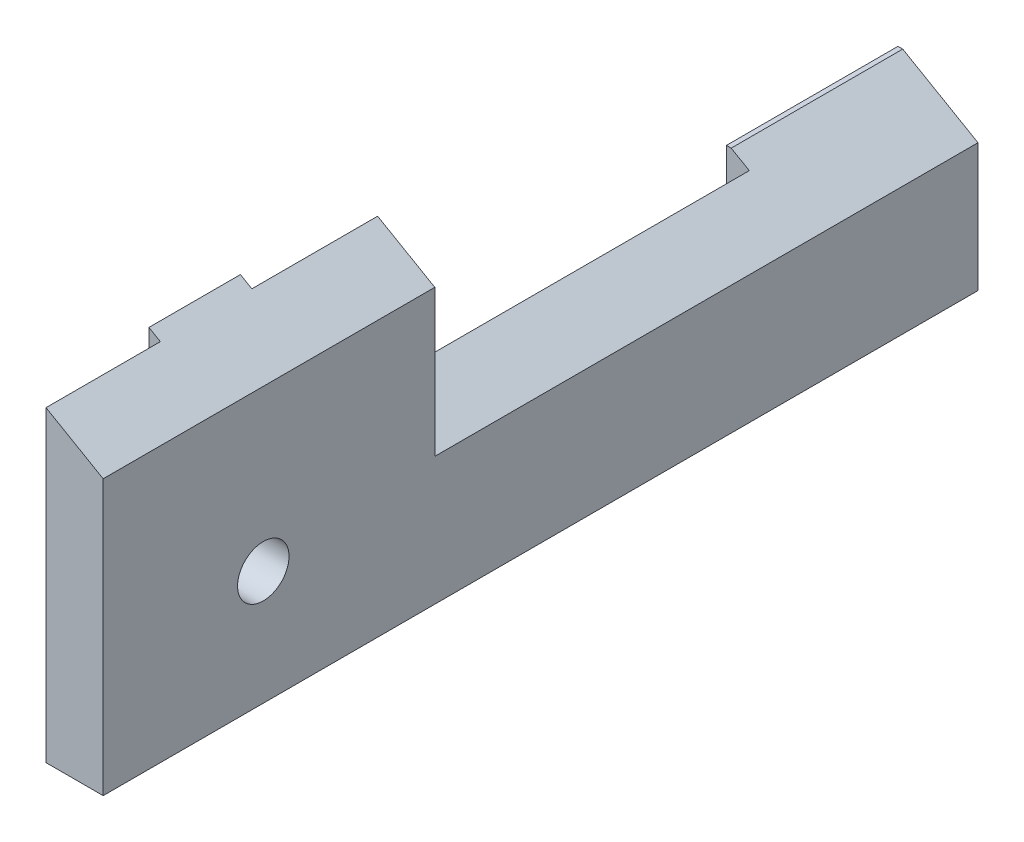
ISO-10303-21;
HEADER;
FILE_DESCRIPTION(('STEP AP214'),'2;1');
FILE_NAME('part.step','',(''),(''),'','','');
FILE_SCHEMA(('AUTOMOTIVE_DESIGN { 1 0 10303 214 1 1 1 1 }'));
ENDSEC;
DATA;
#1=APPLICATION_CONTEXT('core data for automotive mechanical design processes');
#2=APPLICATION_PROTOCOL_DEFINITION('international standard','automotive_design',2000,#1);
#3=PRODUCT_CONTEXT('',#1,'mechanical');
#4=PRODUCT('Part','Part','',(#3));
#5=PRODUCT_RELATED_PRODUCT_CATEGORY('part','',(#4));
#6=PRODUCT_DEFINITION_FORMATION('','',#4);
#7=PRODUCT_DEFINITION_CONTEXT('part definition',#1,'design');
#8=PRODUCT_DEFINITION('design','',#6,#7);
#9=PRODUCT_DEFINITION_SHAPE('','',#8);
#10=(LENGTH_UNIT() NAMED_UNIT(*) SI_UNIT(.MILLI.,.METRE.));
#11=(NAMED_UNIT(*) PLANE_ANGLE_UNIT() SI_UNIT($,.RADIAN.));
#12=(NAMED_UNIT(*) SI_UNIT($,.STERADIAN.) SOLID_ANGLE_UNIT());
#13=UNCERTAINTY_MEASURE_WITH_UNIT(LENGTH_MEASURE(1.E-05),#10,'distance_accuracy_value','');
#14=(GEOMETRIC_REPRESENTATION_CONTEXT(3) GLOBAL_UNCERTAINTY_ASSIGNED_CONTEXT((#13)) GLOBAL_UNIT_ASSIGNED_CONTEXT((#10,
#11,#12)) REPRESENTATION_CONTEXT('',''));
#15=CARTESIAN_POINT('',(0.,0.,0.));
#16=DIRECTION('',(0.,0.,1.));
#17=DIRECTION('',(1.,0.,0.));
#18=AXIS2_PLACEMENT_3D('',#15,#16,#17);
#19=CARTESIAN_POINT('',(0.,14.,-38.25));
#20=DIRECTION('',(-1.,0.,0.));
#21=DIRECTION('',(0.,0.,1.));
#22=AXIS2_PLACEMENT_3D('',#19,#20,#21);
#23=PLANE('',#22);
#24=CARTESIAN_POINT('',(0.,-4.,24.25));
#25=DIRECTION('',(1.,0.,0.));
#26=DIRECTION('',(0.,0.,-1.));
#27=AXIS2_PLACEMENT_3D('',#24,#25,#26);
#28=CIRCLE('',#27,2.25);
#29=CARTESIAN_POINT('',(0.,-4.,22.));
#30=VERTEX_POINT('',#29);
#31=EDGE_CURVE('E164',#30,#30,#28,.T.);
#32=ORIENTED_EDGE('',*,*,#31,.F.);
#33=EDGE_LOOP('',(#32));
#34=FACE_BOUND('',#33,.T.);
#35=DIRECTION('',(0.,-1.,0.));
#36=VECTOR('',#35,1.);
#37=CARTESIAN_POINT('',(0.,14.,-38.25));
#38=LINE('',#37,#36);
#39=CARTESIAN_POINT('',(0.,-2.80000000000005,-38.25));
#40=VERTEX_POINT('',#39);
#41=CARTESIAN_POINT('',(0.,-14.,-38.25));
#42=VERTEX_POINT('',#41);
#43=EDGE_CURVE('E152',#40,#42,#38,.T.);
#44=ORIENTED_EDGE('',*,*,#43,.F.);
#45=DIRECTION('',(0.,0.,1.));
#46=VECTOR('',#45,1.);
#47=CARTESIAN_POINT('',(0.,-2.80000000000005,-38.25));
#48=LINE('',#47,#46);
#49=CARTESIAN_POINT('',(0.,-2.80000000000005,9.24999999999999));
#50=VERTEX_POINT('',#49);
#51=EDGE_CURVE('E184',#40,#50,#48,.T.);
#52=ORIENTED_EDGE('',*,*,#51,.T.);
#53=DIRECTION('',(0.,-1.,0.));
#54=VECTOR('',#53,1.);
#55=CARTESIAN_POINT('',(0.,14.,9.24999999999999));
#56=LINE('',#55,#54);
#57=CARTESIAN_POINT('',(0.,9.99999999999995,9.24999999999999));
#58=VERTEX_POINT('',#57);
#59=EDGE_CURVE('E146',#58,#50,#56,.T.);
#60=ORIENTED_EDGE('',*,*,#59,.F.);
#61=DIRECTION('',(0.,0.,1.));
#62=VECTOR('',#61,1.);
#63=CARTESIAN_POINT('',(0.,9.99999999999995,-38.25));
#64=LINE('',#63,#62);
#65=CARTESIAN_POINT('',(0.,9.99999999999995,38.25));
#66=VERTEX_POINT('',#65);
#67=EDGE_CURVE('E172',#58,#66,#64,.T.);
#68=ORIENTED_EDGE('',*,*,#67,.T.);
#69=DIRECTION('',(0.,-1.,0.));
#70=VECTOR('',#69,1.);
#71=CARTESIAN_POINT('',(0.,14.,38.25));
#72=LINE('',#71,#70);
#73=CARTESIAN_POINT('',(0.,-14.,38.25));
#74=VERTEX_POINT('',#73);
#75=EDGE_CURVE('E202',#66,#74,#72,.T.);
#76=ORIENTED_EDGE('',*,*,#75,.T.);
#77=DIRECTION('',(0.,0.,-1.));
#78=VECTOR('',#77,1.);
#79=CARTESIAN_POINT('',(0.,-14.,-38.25));
#80=LINE('',#79,#78);
#81=EDGE_CURVE('E163',#74,#42,#80,.T.);
#82=ORIENTED_EDGE('',*,*,#81,.T.);
#83=EDGE_LOOP('',(#44,#52,#60,#68,#76,#82));
#84=FACE_BOUND('',#83,.T.);
#85=ADVANCED_FACE('F35',(#34,#84),#23,.F.);
#86=CARTESIAN_POINT('',(0.,14.,-38.25));
#87=DIRECTION('',(0.,0.,1.));
#88=DIRECTION('',(1.,0.,0.));
#89=AXIS2_PLACEMENT_3D('',#86,#87,#88);
#90=PLANE('',#89);
#91=DIRECTION('',(1.,0.,0.));
#92=VECTOR('',#91,1.);
#93=CARTESIAN_POINT('',(-7.00000000000008,0.999999999999999,-38.25));
#94=LINE('',#93,#92);
#95=CARTESIAN_POINT('',(-7.00000000000008,0.999999999999999,-38.25));
#96=VERTEX_POINT('',#95);
#97=CARTESIAN_POINT('',(-6.58179306876187,0.999999999999999,-38.25));
#98=VERTEX_POINT('',#97);
#99=EDGE_CURVE('E129',#96,#98,#94,.T.);
#100=ORIENTED_EDGE('',*,*,#99,.T.);
#101=DIRECTION('',(-0.866025403784441,0.499999999999997,0.));
#102=VECTOR('',#101,1.);
#103=CARTESIAN_POINT('',(-6.58179306876187,0.999999999999999,-38.25));
#104=LINE('',#103,#102);
#105=EDGE_CURVE('E182',#98,#40,#104,.F.);
#106=ORIENTED_EDGE('',*,*,#105,.T.);
#107=ORIENTED_EDGE('',*,*,#43,.T.);
#108=DIRECTION('',(-1.,0.,0.));
#109=VECTOR('',#108,1.);
#110=CARTESIAN_POINT('',(0.,-14.,-38.25));
#111=LINE('',#110,#109);
#112=CARTESIAN_POINT('',(-7.00000000000008,-14.,-38.25));
#113=VERTEX_POINT('',#112);
#114=EDGE_CURVE('E150',#42,#113,#111,.T.);
#115=ORIENTED_EDGE('',*,*,#114,.T.);
#116=DIRECTION('',(0.,-1.,0.));
#117=VECTOR('',#116,1.);
#118=CARTESIAN_POINT('',(-7.00000000000008,14.,-38.25));
#119=LINE('',#118,#117);
#120=EDGE_CURVE('E143',#96,#113,#119,.T.);
#121=ORIENTED_EDGE('',*,*,#120,.F.);
#122=EDGE_LOOP('',(#100,#106,#107,#115,#121));
#123=FACE_BOUND('',#122,.T.);
#124=ADVANCED_FACE('F148',(#123),#90,.F.);
#125=CARTESIAN_POINT('',(-7.00000000000008,14.,-38.25));
#126=DIRECTION('',(1.,0.,0.));
#127=DIRECTION('',(0.,0.,-1.));
#128=AXIS2_PLACEMENT_3D('',#125,#126,#127);
#129=PLANE('',#128);
#130=DIRECTION('',(0.,-1.,0.));
#131=VECTOR('',#130,1.);
#132=CARTESIAN_POINT('',(-7.00000000000008,14.,-23.25));
#133=LINE('',#132,#131);
#134=CARTESIAN_POINT('',(-7.00000000000008,0.999999999999999,-23.25));
#135=VERTEX_POINT('',#134);
#136=CARTESIAN_POINT('',(-7.00000000000008,-14.,-23.25));
#137=VERTEX_POINT('',#136);
#138=EDGE_CURVE('E145',#135,#137,#133,.T.);
#139=ORIENTED_EDGE('',*,*,#138,.F.);
#140=DIRECTION('',(0.,0.,-1.));
#141=VECTOR('',#140,1.);
#142=CARTESIAN_POINT('',(-7.00000000000008,0.999999999999999,9.24999999999999));
#143=LINE('',#142,#141);
#144=EDGE_CURVE('E133',#135,#96,#143,.T.);
#145=ORIENTED_EDGE('',*,*,#144,.T.);
#146=ORIENTED_EDGE('',*,*,#120,.T.);
#147=DIRECTION('',(0.,0.,1.));
#148=VECTOR('',#147,1.);
#149=CARTESIAN_POINT('',(-7.00000000000008,-14.,-38.25));
#150=LINE('',#149,#148);
#151=EDGE_CURVE('E207',#113,#137,#150,.T.);
#152=ORIENTED_EDGE('',*,*,#151,.T.);
#153=EDGE_LOOP('',(#139,#145,#146,#152));
#154=FACE_BOUND('',#153,.T.);
#155=ADVANCED_FACE('F141',(#154),#129,.F.);
#156=CARTESIAN_POINT('',(-7.00000000000008,14.,-23.25));
#157=DIRECTION('',(0.,0.,-1.));
#158=DIRECTION('',(-1.,0.,0.));
#159=AXIS2_PLACEMENT_3D('',#156,#157,#158);
#160=PLANE('',#159);
#161=DIRECTION('',(0.,-1.,0.));
#162=VECTOR('',#161,1.);
#163=CARTESIAN_POINT('',(-5.00000000000013,14.,-23.25));
#164=LINE('',#163,#162);
#165=CARTESIAN_POINT('',(-5.00000000000013,0.0867513459481324,-23.25));
#166=VERTEX_POINT('',#165);
#167=CARTESIAN_POINT('',(-5.00000000000013,-14.,-23.25));
#168=VERTEX_POINT('',#167);
#169=EDGE_CURVE('E156',#166,#168,#164,.T.);
#170=ORIENTED_EDGE('',*,*,#169,.F.);
#171=DIRECTION('',(0.866025403784441,-0.499999999999996,0.));
#172=VECTOR('',#171,1.);
#173=CARTESIAN_POINT('',(-6.58179306876183,0.999999999999975,-23.25));
#174=LINE('',#173,#172);
#175=CARTESIAN_POINT('',(-6.58179306876187,0.999999999999999,-23.25));
#176=VERTEX_POINT('',#175);
#177=EDGE_CURVE('E43',#166,#176,#174,.F.);
#178=ORIENTED_EDGE('',*,*,#177,.T.);
#179=DIRECTION('',(-1.,0.,0.));
#180=VECTOR('',#179,1.);
#181=CARTESIAN_POINT('',(-7.00000000000008,0.999999999999999,-23.25));
#182=LINE('',#181,#180);
#183=EDGE_CURVE('E190',#176,#135,#182,.T.);
#184=ORIENTED_EDGE('',*,*,#183,.T.);
#185=ORIENTED_EDGE('',*,*,#138,.T.);
#186=DIRECTION('',(1.,0.,0.));
#187=VECTOR('',#186,1.);
#188=CARTESIAN_POINT('',(-7.00000000000008,-14.,-23.25));
#189=LINE('',#188,#187);
#190=EDGE_CURVE('E212',#137,#168,#189,.T.);
#191=ORIENTED_EDGE('',*,*,#190,.T.);
#192=EDGE_LOOP('',(#170,#178,#184,#185,#191));
#193=FACE_BOUND('',#192,.T.);
#194=ADVANCED_FACE('F189',(#193),#160,.F.);
#195=CARTESIAN_POINT('',(-5.00000000000013,14.,20.25));
#196=DIRECTION('',(1.,0.,0.));
#197=DIRECTION('',(0.,0.,-1.));
#198=AXIS2_PLACEMENT_3D('',#195,#196,#197);
#199=PLANE('',#198);
#200=DIRECTION('',(0.,-1.,0.));
#201=VECTOR('',#200,1.);
#202=CARTESIAN_POINT('',(-5.00000000000013,14.,9.24999999999999));
#203=LINE('',#202,#201);
#204=CARTESIAN_POINT('',(-5.00000000000013,12.8867513459481,9.24999999999999));
#205=VERTEX_POINT('',#204);
#206=CARTESIAN_POINT('',(-5.00000000000013,0.086751345948132,9.24999999999999));
#207=VERTEX_POINT('',#206);
#208=EDGE_CURVE('E50',#205,#207,#203,.T.);
#209=ORIENTED_EDGE('',*,*,#208,.T.);
#210=DIRECTION('',(0.,0.,1.));
#211=VECTOR('',#210,1.);
#212=CARTESIAN_POINT('',(-5.00000000000013,0.0867513459481321,9.24999999999999));
#213=LINE('',#212,#211);
#214=EDGE_CURVE('E54',#207,#166,#213,.F.);
#215=ORIENTED_EDGE('',*,*,#214,.T.);
#216=ORIENTED_EDGE('',*,*,#169,.T.);
#217=DIRECTION('',(0.,0.,1.));
#218=VECTOR('',#217,1.);
#219=CARTESIAN_POINT('',(-5.00000000000013,-14.,20.25));
#220=LINE('',#219,#218);
#221=CARTESIAN_POINT('',(-5.00000000000013,-14.,20.25));
#222=VERTEX_POINT('',#221);
#223=EDGE_CURVE('E214',#168,#222,#220,.T.);
#224=ORIENTED_EDGE('',*,*,#223,.T.);
#225=DIRECTION('',(0.,-1.,0.));
#226=VECTOR('',#225,1.);
#227=CARTESIAN_POINT('',(-5.00000000000013,14.,20.25));
#228=LINE('',#227,#226);
#229=CARTESIAN_POINT('',(-5.00000000000013,12.8867513459481,20.25));
#230=VERTEX_POINT('',#229);
#231=EDGE_CURVE('E240',#230,#222,#228,.T.);
#232=ORIENTED_EDGE('',*,*,#231,.F.);
#233=DIRECTION('',(0.,0.,1.));
#234=VECTOR('',#233,1.);
#235=CARTESIAN_POINT('',(-5.00000000000013,12.8867513459481,0.));
#236=LINE('',#235,#234);
#237=EDGE_CURVE('E168',#230,#205,#236,.F.);
#238=ORIENTED_EDGE('',*,*,#237,.T.);
#239=EDGE_LOOP('',(#209,#215,#216,#224,#232,#238));
#240=FACE_BOUND('',#239,.T.);
#241=ADVANCED_FACE('F241',(#240),#199,.F.);
#242=CARTESIAN_POINT('',(-5.00000000000013,14.,20.25));
#243=DIRECTION('',(0.,0.,1.));
#244=DIRECTION('',(1.,0.,0.));
#245=AXIS2_PLACEMENT_3D('',#242,#243,#244);
#246=PLANE('',#245);
#247=DIRECTION('',(0.,-1.,0.));
#248=VECTOR('',#247,1.);
#249=CARTESIAN_POINT('',(-6.00000000000013,14.,20.25));
#250=LINE('',#249,#248);
#251=CARTESIAN_POINT('',(-6.00000000000013,13.4641016151377,20.25));
#252=VERTEX_POINT('',#251);
#253=CARTESIAN_POINT('',(-6.00000000000013,-14.,20.25));
#254=VERTEX_POINT('',#253);
#255=EDGE_CURVE('E238',#252,#254,#250,.T.);
#256=ORIENTED_EDGE('',*,*,#255,.F.);
#257=DIRECTION('',(-0.866025403784441,0.499999999999997,0.));
#258=VECTOR('',#257,1.);
#259=CARTESIAN_POINT('',(-6.92820323027571,14.,20.25));
#260=LINE('',#259,#258);
#261=EDGE_CURVE('E166',#252,#230,#260,.F.);
#262=ORIENTED_EDGE('',*,*,#261,.T.);
#263=ORIENTED_EDGE('',*,*,#231,.T.);
#264=DIRECTION('',(-1.,0.,0.));
#265=VECTOR('',#264,1.);
#266=CARTESIAN_POINT('',(-5.00000000000013,-14.,20.25));
#267=LINE('',#266,#265);
#268=EDGE_CURVE('E217',#222,#254,#267,.T.);
#269=ORIENTED_EDGE('',*,*,#268,.T.);
#270=EDGE_LOOP('',(#256,#262,#263,#269));
#271=FACE_BOUND('',#270,.T.);
#272=ADVANCED_FACE('F251',(#271),#246,.F.);
#273=CARTESIAN_POINT('',(-6.00000000000013,14.,20.25));
#274=DIRECTION('',(1.,0.,0.));
#275=DIRECTION('',(0.,0.,-1.));
#276=AXIS2_PLACEMENT_3D('',#273,#274,#275);
#277=PLANE('',#276);
#278=CARTESIAN_POINT('',(-6.00000000000012,-4.,24.25));
#279=DIRECTION('',(1.,0.,0.));
#280=DIRECTION('',(0.,0.,-1.));
#281=AXIS2_PLACEMENT_3D('',#278,#279,#280);
#282=CIRCLE('',#281,2.25);
#283=CARTESIAN_POINT('',(-6.00000000000012,-4.,22.));
#284=VERTEX_POINT('',#283);
#285=EDGE_CURVE('E160',#284,#284,#282,.T.);
#286=ORIENTED_EDGE('',*,*,#285,.T.);
#287=EDGE_LOOP('',(#286));
#288=FACE_BOUND('',#287,.T.);
#289=DIRECTION('',(0.,-1.,0.));
#290=VECTOR('',#289,1.);
#291=CARTESIAN_POINT('',(-6.00000000000012,14.,28.25));
#292=LINE('',#291,#290);
#293=CARTESIAN_POINT('',(-6.00000000000012,13.4641016151377,28.25));
#294=VERTEX_POINT('',#293);
#295=CARTESIAN_POINT('',(-6.00000000000012,-14.,28.25));
#296=VERTEX_POINT('',#295);
#297=EDGE_CURVE('E236',#294,#296,#292,.T.);
#298=ORIENTED_EDGE('',*,*,#297,.F.);
#299=DIRECTION('',(0.,0.,1.));
#300=VECTOR('',#299,1.);
#301=CARTESIAN_POINT('',(-6.00000000000013,13.4641016151378,0.));
#302=LINE('',#301,#300);
#303=EDGE_CURVE('E154',#294,#252,#302,.F.);
#304=ORIENTED_EDGE('',*,*,#303,.T.);
#305=ORIENTED_EDGE('',*,*,#255,.T.);
#306=DIRECTION('',(0.,0.,1.));
#307=VECTOR('',#306,1.);
#308=CARTESIAN_POINT('',(-6.00000000000013,-14.,20.25));
#309=LINE('',#308,#307);
#310=EDGE_CURVE('E220',#254,#296,#309,.T.);
#311=ORIENTED_EDGE('',*,*,#310,.T.);
#312=EDGE_LOOP('',(#298,#304,#305,#311));
#313=FACE_BOUND('',#312,.T.);
#314=ADVANCED_FACE('F276',(#288,#313),#277,.F.);
#315=CARTESIAN_POINT('',(-5.00000000000013,14.,28.25));
#316=DIRECTION('',(0.,0.,-1.));
#317=DIRECTION('',(-1.,0.,0.));
#318=AXIS2_PLACEMENT_3D('',#315,#316,#317);
#319=PLANE('',#318);
#320=DIRECTION('',(0.,-1.,0.));
#321=VECTOR('',#320,1.);
#322=CARTESIAN_POINT('',(-5.00000000000013,14.,28.25));
#323=LINE('',#322,#321);
#324=CARTESIAN_POINT('',(-5.00000000000013,12.8867513459481,28.25));
#325=VERTEX_POINT('',#324);
#326=CARTESIAN_POINT('',(-5.00000000000013,-14.,28.25));
#327=VERTEX_POINT('',#326);
#328=EDGE_CURVE('E234',#325,#327,#323,.T.);
#329=ORIENTED_EDGE('',*,*,#328,.F.);
#330=DIRECTION('',(0.866025403784441,-0.499999999999997,0.));
#331=VECTOR('',#330,1.);
#332=CARTESIAN_POINT('',(-6.92820323027573,14.,28.25));
#333=LINE('',#332,#331);
#334=EDGE_CURVE('E179',#325,#294,#333,.F.);
#335=ORIENTED_EDGE('',*,*,#334,.T.);
#336=ORIENTED_EDGE('',*,*,#297,.T.);
#337=DIRECTION('',(1.,0.,0.));
#338=VECTOR('',#337,1.);
#339=CARTESIAN_POINT('',(-5.00000000000013,-14.,28.25));
#340=LINE('',#339,#338);
#341=EDGE_CURVE('E223',#296,#327,#340,.T.);
#342=ORIENTED_EDGE('',*,*,#341,.T.);
#343=EDGE_LOOP('',(#329,#335,#336,#342));
#344=FACE_BOUND('',#343,.T.);
#345=ADVANCED_FACE('F273',(#344),#319,.F.);
#346=CARTESIAN_POINT('',(-5.00000000000013,14.,38.25));
#347=DIRECTION('',(1.,0.,0.));
#348=DIRECTION('',(0.,0.,-1.));
#349=AXIS2_PLACEMENT_3D('',#346,#347,#348);
#350=PLANE('',#349);
#351=DIRECTION('',(0.,-1.,0.));
#352=VECTOR('',#351,1.);
#353=CARTESIAN_POINT('',(-5.00000000000013,14.,38.25));
#354=LINE('',#353,#352);
#355=CARTESIAN_POINT('',(-5.00000000000013,12.8867513459481,38.25));
#356=VERTEX_POINT('',#355);
#357=CARTESIAN_POINT('',(-5.00000000000013,-14.,38.25));
#358=VERTEX_POINT('',#357);
#359=EDGE_CURVE('E232',#356,#358,#354,.T.);
#360=ORIENTED_EDGE('',*,*,#359,.F.);
#361=DIRECTION('',(0.,0.,1.));
#362=VECTOR('',#361,1.);
#363=CARTESIAN_POINT('',(-5.00000000000014,12.8867513459481,0.));
#364=LINE('',#363,#362);
#365=EDGE_CURVE('E177',#356,#325,#364,.F.);
#366=ORIENTED_EDGE('',*,*,#365,.T.);
#367=ORIENTED_EDGE('',*,*,#328,.T.);
#368=DIRECTION('',(0.,0.,1.));
#369=VECTOR('',#368,1.);
#370=CARTESIAN_POINT('',(-5.00000000000013,-14.,38.25));
#371=LINE('',#370,#369);
#372=EDGE_CURVE('E226',#327,#358,#371,.T.);
#373=ORIENTED_EDGE('',*,*,#372,.T.);
#374=EDGE_LOOP('',(#360,#366,#367,#373));
#375=FACE_BOUND('',#374,.T.);
#376=ADVANCED_FACE('F268',(#375),#350,.F.);
#377=CARTESIAN_POINT('',(0.,14.,38.25));
#378=DIRECTION('',(0.,0.,-1.));
#379=DIRECTION('',(-1.,0.,0.));
#380=AXIS2_PLACEMENT_3D('',#377,#378,#379);
#381=PLANE('',#380);
#382=ORIENTED_EDGE('',*,*,#75,.F.);
#383=DIRECTION('',(0.866025403784441,-0.499999999999997,0.));
#384=VECTOR('',#383,1.);
#385=CARTESIAN_POINT('',(-6.92820323027565,14.,38.25));
#386=LINE('',#385,#384);
#387=EDGE_CURVE('E175',#66,#356,#386,.F.);
#388=ORIENTED_EDGE('',*,*,#387,.T.);
#389=ORIENTED_EDGE('',*,*,#359,.T.);
#390=DIRECTION('',(1.,0.,0.));
#391=VECTOR('',#390,1.);
#392=CARTESIAN_POINT('',(0.,-14.,38.25));
#393=LINE('',#392,#391);
#394=EDGE_CURVE('E229',#358,#74,#393,.T.);
#395=ORIENTED_EDGE('',*,*,#394,.T.);
#396=EDGE_LOOP('',(#382,#388,#389,#395));
#397=FACE_BOUND('',#396,.T.);
#398=ADVANCED_FACE('F264',(#397),#381,.F.);
#399=CARTESIAN_POINT('',(0.,-14.,0.));
#400=DIRECTION('',(0.,-1.,0.));
#401=DIRECTION('',(0.,0.,-1.));
#402=AXIS2_PLACEMENT_3D('',#399,#400,#401);
#403=PLANE('',#402);
#404=ORIENTED_EDGE('',*,*,#81,.F.);
#405=ORIENTED_EDGE('',*,*,#394,.F.);
#406=ORIENTED_EDGE('',*,*,#372,.F.);
#407=ORIENTED_EDGE('',*,*,#341,.F.);
#408=ORIENTED_EDGE('',*,*,#310,.F.);
#409=ORIENTED_EDGE('',*,*,#268,.F.);
#410=ORIENTED_EDGE('',*,*,#223,.F.);
#411=ORIENTED_EDGE('',*,*,#190,.F.);
#412=ORIENTED_EDGE('',*,*,#151,.F.);
#413=ORIENTED_EDGE('',*,*,#114,.F.);
#414=EDGE_LOOP('',(#404,#405,#406,#407,#408,#409,#410,#411,#412,#413));
#415=FACE_BOUND('',#414,.T.);
#416=ADVANCED_FACE('F246',(#415),#403,.T.);
#417=CARTESIAN_POINT('',(-7.00000000000008,-4.,24.25));
#418=DIRECTION('',(1.,0.,0.));
#419=DIRECTION('',(0.,0.,-1.));
#420=AXIS2_PLACEMENT_3D('',#417,#418,#419);
#421=CYLINDRICAL_SURFACE('',#420,2.25);
#422=ORIENTED_EDGE('',*,*,#31,.T.);
#423=EDGE_LOOP('',(#422));
#424=FACE_BOUND('',#423,.T.);
#425=ORIENTED_EDGE('',*,*,#285,.F.);
#426=EDGE_LOOP('',(#425));
#427=FACE_BOUND('',#426,.T.);
#428=ADVANCED_FACE('F304',(#424,#427),#421,.F.);
#429=CARTESIAN_POINT('',(-7.00000000000008,0.999999999999999,9.24999999999999));
#430=DIRECTION('',(0.,-1.,0.));
#431=DIRECTION('',(0.,0.,-1.));
#432=AXIS2_PLACEMENT_3D('',#429,#430,#431);
#433=PLANE('',#432);
#434=ORIENTED_EDGE('',*,*,#183,.F.);
#435=DIRECTION('',(0.,0.,-1.));
#436=VECTOR('',#435,1.);
#437=CARTESIAN_POINT('',(-6.58179306876187,0.999999999999999,9.24999999999999));
#438=LINE('',#437,#436);
#439=EDGE_CURVE('E136',#176,#98,#438,.T.);
#440=ORIENTED_EDGE('',*,*,#439,.T.);
#441=ORIENTED_EDGE('',*,*,#99,.F.);
#442=ORIENTED_EDGE('',*,*,#144,.F.);
#443=EDGE_LOOP('',(#434,#440,#441,#442));
#444=FACE_BOUND('',#443,.T.);
#445=ADVANCED_FACE('F132',(#444),#433,.F.);
#446=CARTESIAN_POINT('',(-7.00000000000008,14.,9.24999999999999));
#447=DIRECTION('',(0.,0.,1.));
#448=DIRECTION('',(1.,0.,0.));
#449=AXIS2_PLACEMENT_3D('',#446,#447,#448);
#450=PLANE('',#449);
#451=ORIENTED_EDGE('',*,*,#208,.F.);
#452=DIRECTION('',(-0.866025403784441,0.499999999999997,0.));
#453=VECTOR('',#452,1.);
#454=CARTESIAN_POINT('',(-6.92820323027565,14.,9.24999999999999));
#455=LINE('',#454,#453);
#456=EDGE_CURVE('E170',#205,#58,#455,.F.);
#457=ORIENTED_EDGE('',*,*,#456,.T.);
#458=ORIENTED_EDGE('',*,*,#59,.T.);
#459=DIRECTION('',(0.866025403784441,-0.499999999999996,0.));
#460=VECTOR('',#459,1.);
#461=CARTESIAN_POINT('',(-12.5246133917894,4.43108891324546,9.24999999999999));
#462=LINE('',#461,#460);
#463=EDGE_CURVE('E11',#50,#207,#462,.F.);
#464=ORIENTED_EDGE('',*,*,#463,.T.);
#465=EDGE_LOOP('',(#451,#457,#458,#464));
#466=FACE_BOUND('',#465,.T.);
#467=ADVANCED_FACE('F260',(#466),#450,.F.);
#468=CARTESIAN_POINT('',(-6.92820323027565,14.,0.));
#469=DIRECTION('',(-0.499999999999996,-0.866025403784441,0.));
#470=DIRECTION('',(0.,0.,-1.));
#471=AXIS2_PLACEMENT_3D('',#468,#469,#470);
#472=PLANE('',#471);
#473=ORIENTED_EDGE('',*,*,#387,.F.);
#474=ORIENTED_EDGE('',*,*,#67,.F.);
#475=ORIENTED_EDGE('',*,*,#456,.F.);
#476=ORIENTED_EDGE('',*,*,#237,.F.);
#477=ORIENTED_EDGE('',*,*,#261,.F.);
#478=ORIENTED_EDGE('',*,*,#303,.F.);
#479=ORIENTED_EDGE('',*,*,#334,.F.);
#480=ORIENTED_EDGE('',*,*,#365,.F.);
#481=EDGE_LOOP('',(#473,#474,#475,#476,#477,#478,#479,#480));
#482=FACE_BOUND('',#481,.T.);
#483=ADVANCED_FACE('F256',(#482),#472,.F.);
#484=CARTESIAN_POINT('',(-6.58179306876187,0.999999999999999,9.24999999999999));
#485=DIRECTION('',(-0.499999999999996,-0.866025403784441,0.));
#486=DIRECTION('',(0.,0.,-1.));
#487=AXIS2_PLACEMENT_3D('',#484,#485,#486);
#488=PLANE('',#487);
#489=ORIENTED_EDGE('',*,*,#463,.F.);
#490=ORIENTED_EDGE('',*,*,#51,.F.);
#491=ORIENTED_EDGE('',*,*,#105,.F.);
#492=ORIENTED_EDGE('',*,*,#439,.F.);
#493=ORIENTED_EDGE('',*,*,#177,.F.);
#494=ORIENTED_EDGE('',*,*,#214,.F.);
#495=EDGE_LOOP('',(#489,#490,#491,#492,#493,#494));
#496=FACE_BOUND('',#495,.T.);
#497=ADVANCED_FACE('F37',(#496),#488,.F.);
#498=CLOSED_SHELL('',(#85,#124,#155,#194,#241,#272,#314,#345,#376,#398,#416,#428,#445,#467,#483,#497));
#499=MANIFOLD_SOLID_BREP('B2',#498);
#500=ADVANCED_BREP_SHAPE_REPRESENTATION('',(#18,#499),#14);
#501=SHAPE_DEFINITION_REPRESENTATION(#9,#500);
ENDSEC;
END-ISO-10303-21;
